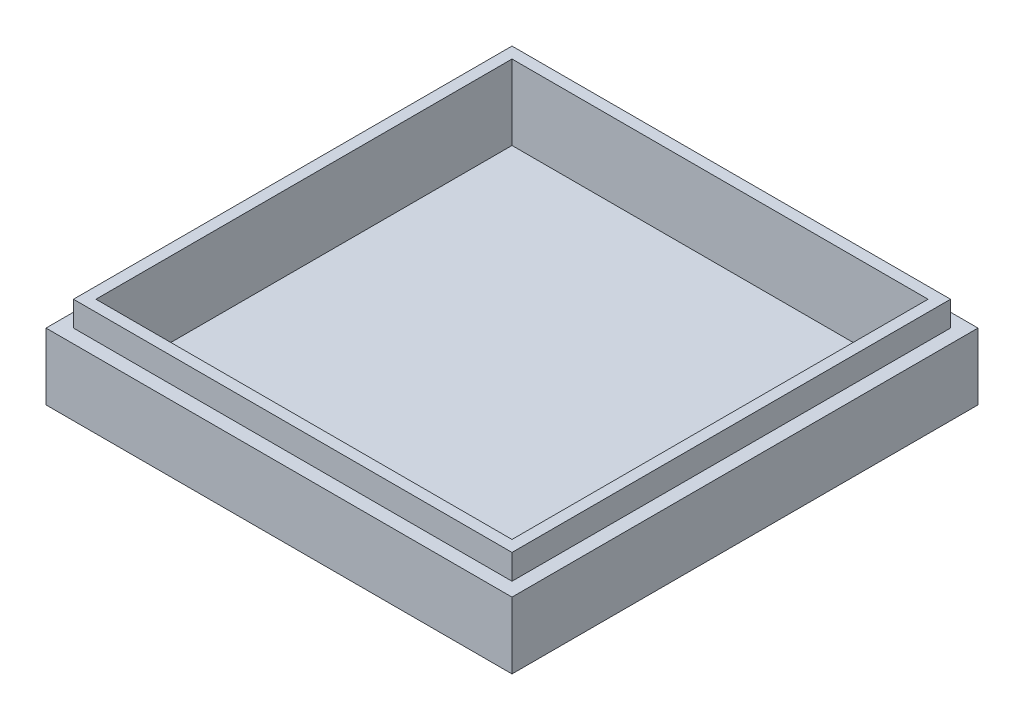
ISO-10303-21;
HEADER;
FILE_DESCRIPTION(('STEP AP214'),'2;1');
FILE_NAME('part.step','',(''),(''),'','','');
FILE_SCHEMA(('AUTOMOTIVE_DESIGN { 1 0 10303 214 1 1 1 1 }'));
ENDSEC;
DATA;
#1=APPLICATION_CONTEXT('core data for automotive mechanical design processes');
#2=APPLICATION_PROTOCOL_DEFINITION('international standard','automotive_design',2000,#1);
#3=PRODUCT_CONTEXT('',#1,'mechanical');
#4=PRODUCT('Part','Part','',(#3));
#5=PRODUCT_RELATED_PRODUCT_CATEGORY('part','',(#4));
#6=PRODUCT_DEFINITION_FORMATION('','',#4);
#7=PRODUCT_DEFINITION_CONTEXT('part definition',#1,'design');
#8=PRODUCT_DEFINITION('design','',#6,#7);
#9=PRODUCT_DEFINITION_SHAPE('','',#8);
#10=(LENGTH_UNIT() NAMED_UNIT(*) SI_UNIT(.MILLI.,.METRE.));
#11=(NAMED_UNIT(*) PLANE_ANGLE_UNIT() SI_UNIT($,.RADIAN.));
#12=(NAMED_UNIT(*) SI_UNIT($,.STERADIAN.) SOLID_ANGLE_UNIT());
#13=UNCERTAINTY_MEASURE_WITH_UNIT(LENGTH_MEASURE(1.E-05),#10,'distance_accuracy_value','');
#14=(GEOMETRIC_REPRESENTATION_CONTEXT(3) GLOBAL_UNCERTAINTY_ASSIGNED_CONTEXT((#13)) GLOBAL_UNIT_ASSIGNED_CONTEXT((#10,
#11,#12)) REPRESENTATION_CONTEXT('',''));
#15=CARTESIAN_POINT('',(0.,0.,0.));
#16=DIRECTION('',(0.,0.,1.));
#17=DIRECTION('',(1.,0.,0.));
#18=AXIS2_PLACEMENT_3D('',#15,#16,#17);
#19=CARTESIAN_POINT('',(0.,6.,0.));
#20=DIRECTION('',(0.,1.,0.));
#21=DIRECTION('',(0.,0.,1.));
#22=AXIS2_PLACEMENT_3D('',#19,#20,#21);
#23=PLANE('',#22);
#24=DIRECTION('',(0.,0.,1.));
#25=VECTOR('',#24,1.);
#26=CARTESIAN_POINT('',(-28.,6.,-28.));
#27=LINE('',#26,#25);
#28=CARTESIAN_POINT('',(-28.,6.,-28.));
#29=VERTEX_POINT('',#28);
#30=CARTESIAN_POINT('',(-28.,6.,28.));
#31=VERTEX_POINT('',#30);
#32=EDGE_CURVE('E191',#29,#31,#27,.T.);
#33=ORIENTED_EDGE('',*,*,#32,.T.);
#34=DIRECTION('',(1.,0.,0.));
#35=VECTOR('',#34,1.);
#36=CARTESIAN_POINT('',(-28.,6.,28.));
#37=LINE('',#36,#35);
#38=CARTESIAN_POINT('',(28.,6.,28.));
#39=VERTEX_POINT('',#38);
#40=EDGE_CURVE('E194',#31,#39,#37,.T.);
#41=ORIENTED_EDGE('',*,*,#40,.T.);
#42=DIRECTION('',(0.,0.,-1.));
#43=VECTOR('',#42,1.);
#44=CARTESIAN_POINT('',(28.,6.,-28.));
#45=LINE('',#44,#43);
#46=CARTESIAN_POINT('',(28.,6.,-28.));
#47=VERTEX_POINT('',#46);
#48=EDGE_CURVE('E197',#39,#47,#45,.T.);
#49=ORIENTED_EDGE('',*,*,#48,.T.);
#50=DIRECTION('',(-1.,0.,0.));
#51=VECTOR('',#50,1.);
#52=CARTESIAN_POINT('',(-28.,6.,-28.));
#53=LINE('',#52,#51);
#54=EDGE_CURVE('E200',#47,#29,#53,.T.);
#55=ORIENTED_EDGE('',*,*,#54,.T.);
#56=EDGE_LOOP('',(#33,#41,#49,#55));
#57=FACE_BOUND('',#56,.T.);
#58=DIRECTION('',(0.,0.,-1.));
#59=VECTOR('',#58,1.);
#60=CARTESIAN_POINT('',(26.35,6.,26.35));
#61=LINE('',#60,#59);
#62=CARTESIAN_POINT('',(26.35,6.,26.35));
#63=VERTEX_POINT('',#62);
#64=CARTESIAN_POINT('',(26.35,6.,-26.35));
#65=VERTEX_POINT('',#64);
#66=EDGE_CURVE('E166',#63,#65,#61,.T.);
#67=ORIENTED_EDGE('',*,*,#66,.F.);
#68=DIRECTION('',(1.,0.,0.));
#69=VECTOR('',#68,1.);
#70=CARTESIAN_POINT('',(-26.35,6.,26.35));
#71=LINE('',#70,#69);
#72=CARTESIAN_POINT('',(-26.35,6.,26.35));
#73=VERTEX_POINT('',#72);
#74=EDGE_CURVE('E152',#73,#63,#71,.T.);
#75=ORIENTED_EDGE('',*,*,#74,.F.);
#76=DIRECTION('',(0.,0.,1.));
#77=VECTOR('',#76,1.);
#78=CARTESIAN_POINT('',(-26.35,6.,-26.35));
#79=LINE('',#78,#77);
#80=CARTESIAN_POINT('',(-26.35,6.,-26.35));
#81=VERTEX_POINT('',#80);
#82=EDGE_CURVE('E157',#81,#73,#79,.T.);
#83=ORIENTED_EDGE('',*,*,#82,.F.);
#84=DIRECTION('',(-1.,0.,0.));
#85=VECTOR('',#84,1.);
#86=CARTESIAN_POINT('',(26.35,6.,-26.35));
#87=LINE('',#86,#85);
#88=EDGE_CURVE('E168',#65,#81,#87,.T.);
#89=ORIENTED_EDGE('',*,*,#88,.F.);
#90=EDGE_LOOP('',(#67,#75,#83,#89));
#91=FACE_BOUND('',#90,.T.);
#92=ADVANCED_FACE('F33',(#57,#91),#23,.T.);
#93=CARTESIAN_POINT('',(-28.,-2.,-28.));
#94=DIRECTION('',(-1.,0.,0.));
#95=DIRECTION('',(0.,0.,1.));
#96=AXIS2_PLACEMENT_3D('',#93,#94,#95);
#97=PLANE('',#96);
#98=DIRECTION('',(0.,1.,0.));
#99=VECTOR('',#98,1.);
#100=CARTESIAN_POINT('',(-28.,-2.,28.));
#101=LINE('',#100,#99);
#102=CARTESIAN_POINT('',(-28.,-2.,28.));
#103=VERTEX_POINT('',#102);
#104=EDGE_CURVE('E37',#103,#31,#101,.T.);
#105=ORIENTED_EDGE('',*,*,#104,.T.);
#106=ORIENTED_EDGE('',*,*,#32,.F.);
#107=DIRECTION('',(0.,1.,0.));
#108=VECTOR('',#107,1.);
#109=CARTESIAN_POINT('',(-28.,-2.,-28.));
#110=LINE('',#109,#108);
#111=CARTESIAN_POINT('',(-28.,-2.,-28.));
#112=VERTEX_POINT('',#111);
#113=EDGE_CURVE('E11',#112,#29,#110,.T.);
#114=ORIENTED_EDGE('',*,*,#113,.F.);
#115=DIRECTION('',(0.,0.,1.));
#116=VECTOR('',#115,1.);
#117=CARTESIAN_POINT('',(-28.,-2.,-28.));
#118=LINE('',#117,#116);
#119=EDGE_CURVE('E203',#112,#103,#118,.T.);
#120=ORIENTED_EDGE('',*,*,#119,.T.);
#121=EDGE_LOOP('',(#105,#106,#114,#120));
#122=FACE_BOUND('',#121,.T.);
#123=ADVANCED_FACE('F35',(#122),#97,.T.);
#124=CARTESIAN_POINT('',(-28.,-2.,-28.));
#125=DIRECTION('',(0.,0.,1.));
#126=DIRECTION('',(1.,0.,0.));
#127=AXIS2_PLACEMENT_3D('',#124,#125,#126);
#128=PLANE('',#127);
#129=ORIENTED_EDGE('',*,*,#113,.T.);
#130=ORIENTED_EDGE('',*,*,#54,.F.);
#131=DIRECTION('',(0.,1.,0.));
#132=VECTOR('',#131,1.);
#133=CARTESIAN_POINT('',(28.,-2.,-28.));
#134=LINE('',#133,#132);
#135=CARTESIAN_POINT('',(28.,-2.,-28.));
#136=VERTEX_POINT('',#135);
#137=EDGE_CURVE('E42',#136,#47,#134,.T.);
#138=ORIENTED_EDGE('',*,*,#137,.F.);
#139=DIRECTION('',(1.,0.,0.));
#140=VECTOR('',#139,1.);
#141=CARTESIAN_POINT('',(-28.,-2.,-28.));
#142=LINE('',#141,#140);
#143=EDGE_CURVE('E211',#112,#136,#142,.T.);
#144=ORIENTED_EDGE('',*,*,#143,.F.);
#145=EDGE_LOOP('',(#129,#130,#138,#144));
#146=FACE_BOUND('',#145,.T.);
#147=ADVANCED_FACE('F228',(#146),#128,.F.);
#148=CARTESIAN_POINT('',(28.,-2.,-28.));
#149=DIRECTION('',(-1.,0.,0.));
#150=DIRECTION('',(0.,0.,1.));
#151=AXIS2_PLACEMENT_3D('',#148,#149,#150);
#152=PLANE('',#151);
#153=ORIENTED_EDGE('',*,*,#137,.T.);
#154=ORIENTED_EDGE('',*,*,#48,.F.);
#155=DIRECTION('',(0.,1.,0.));
#156=VECTOR('',#155,1.);
#157=CARTESIAN_POINT('',(28.,-2.,28.));
#158=LINE('',#157,#156);
#159=CARTESIAN_POINT('',(28.,-2.,28.));
#160=VERTEX_POINT('',#159);
#161=EDGE_CURVE('E213',#160,#39,#158,.T.);
#162=ORIENTED_EDGE('',*,*,#161,.F.);
#163=DIRECTION('',(0.,0.,1.));
#164=VECTOR('',#163,1.);
#165=CARTESIAN_POINT('',(28.,-2.,-28.));
#166=LINE('',#165,#164);
#167=EDGE_CURVE('E209',#136,#160,#166,.T.);
#168=ORIENTED_EDGE('',*,*,#167,.F.);
#169=EDGE_LOOP('',(#153,#154,#162,#168));
#170=FACE_BOUND('',#169,.T.);
#171=ADVANCED_FACE('F234',(#170),#152,.F.);
#172=CARTESIAN_POINT('',(-28.,-2.,28.));
#173=DIRECTION('',(0.,0.,1.));
#174=DIRECTION('',(1.,0.,0.));
#175=AXIS2_PLACEMENT_3D('',#172,#173,#174);
#176=PLANE('',#175);
#177=ORIENTED_EDGE('',*,*,#161,.T.);
#178=ORIENTED_EDGE('',*,*,#40,.F.);
#179=ORIENTED_EDGE('',*,*,#104,.F.);
#180=DIRECTION('',(1.,0.,0.));
#181=VECTOR('',#180,1.);
#182=CARTESIAN_POINT('',(-28.,-2.,28.));
#183=LINE('',#182,#181);
#184=EDGE_CURVE('E206',#103,#160,#183,.T.);
#185=ORIENTED_EDGE('',*,*,#184,.T.);
#186=EDGE_LOOP('',(#177,#178,#179,#185));
#187=FACE_BOUND('',#186,.T.);
#188=ADVANCED_FACE('F221',(#187),#176,.T.);
#189=CARTESIAN_POINT('',(0.,-2.,0.));
#190=DIRECTION('',(0.,1.,0.));
#191=DIRECTION('',(0.,0.,1.));
#192=AXIS2_PLACEMENT_3D('',#189,#190,#191);
#193=PLANE('',#192);
#194=ORIENTED_EDGE('',*,*,#119,.F.);
#195=ORIENTED_EDGE('',*,*,#143,.T.);
#196=ORIENTED_EDGE('',*,*,#167,.T.);
#197=ORIENTED_EDGE('',*,*,#184,.F.);
#198=EDGE_LOOP('',(#194,#195,#196,#197));
#199=FACE_BOUND('',#198,.T.);
#200=ADVANCED_FACE('F232',(#199),#193,.F.);
#201=CARTESIAN_POINT('',(0.,9.,0.));
#202=DIRECTION('',(0.,1.,0.));
#203=DIRECTION('',(0.,0.,1.));
#204=AXIS2_PLACEMENT_3D('',#201,#202,#203);
#205=PLANE('',#204);
#206=DIRECTION('',(1.,0.,0.));
#207=VECTOR('',#206,1.);
#208=CARTESIAN_POINT('',(-26.35,9.,26.35));
#209=LINE('',#208,#207);
#210=CARTESIAN_POINT('',(-26.35,9.,26.35));
#211=VERTEX_POINT('',#210);
#212=CARTESIAN_POINT('',(26.35,9.,26.35));
#213=VERTEX_POINT('',#212);
#214=EDGE_CURVE('E153',#211,#213,#209,.T.);
#215=ORIENTED_EDGE('',*,*,#214,.T.);
#216=DIRECTION('',(0.,0.,-1.));
#217=VECTOR('',#216,1.);
#218=CARTESIAN_POINT('',(26.35,9.,26.35));
#219=LINE('',#218,#217);
#220=CARTESIAN_POINT('',(26.35,9.,-26.35));
#221=VERTEX_POINT('',#220);
#222=EDGE_CURVE('E156',#213,#221,#219,.T.);
#223=ORIENTED_EDGE('',*,*,#222,.T.);
#224=DIRECTION('',(-1.,0.,0.));
#225=VECTOR('',#224,1.);
#226=CARTESIAN_POINT('',(26.35,9.,-26.35));
#227=LINE('',#226,#225);
#228=CARTESIAN_POINT('',(-26.35,9.,-26.35));
#229=VERTEX_POINT('',#228);
#230=EDGE_CURVE('E159',#221,#229,#227,.T.);
#231=ORIENTED_EDGE('',*,*,#230,.T.);
#232=DIRECTION('',(0.,0.,1.));
#233=VECTOR('',#232,1.);
#234=CARTESIAN_POINT('',(-26.35,9.,-26.35));
#235=LINE('',#234,#233);
#236=EDGE_CURVE('E161',#229,#211,#235,.T.);
#237=ORIENTED_EDGE('',*,*,#236,.T.);
#238=EDGE_LOOP('',(#215,#223,#231,#237));
#239=FACE_BOUND('',#238,.T.);
#240=DIRECTION('',(0.,0.,-1.));
#241=VECTOR('',#240,1.);
#242=CARTESIAN_POINT('',(25.,9.,25.));
#243=LINE('',#242,#241);
#244=CARTESIAN_POINT('',(25.,9.,25.));
#245=VERTEX_POINT('',#244);
#246=CARTESIAN_POINT('',(25.,9.,-25.));
#247=VERTEX_POINT('',#246);
#248=EDGE_CURVE('E129',#245,#247,#243,.T.);
#249=ORIENTED_EDGE('',*,*,#248,.F.);
#250=DIRECTION('',(1.,0.,0.));
#251=VECTOR('',#250,1.);
#252=CARTESIAN_POINT('',(-25.,9.,25.));
#253=LINE('',#252,#251);
#254=CARTESIAN_POINT('',(-25.,9.,25.));
#255=VERTEX_POINT('',#254);
#256=EDGE_CURVE('E137',#255,#245,#253,.T.);
#257=ORIENTED_EDGE('',*,*,#256,.F.);
#258=DIRECTION('',(0.,0.,1.));
#259=VECTOR('',#258,1.);
#260=CARTESIAN_POINT('',(-25.,9.,-25.));
#261=LINE('',#260,#259);
#262=CARTESIAN_POINT('',(-25.,9.,-25.));
#263=VERTEX_POINT('',#262);
#264=EDGE_CURVE('E148',#263,#255,#261,.T.);
#265=ORIENTED_EDGE('',*,*,#264,.F.);
#266=DIRECTION('',(-1.,0.,0.));
#267=VECTOR('',#266,1.);
#268=CARTESIAN_POINT('',(25.,9.,-25.));
#269=LINE('',#268,#267);
#270=EDGE_CURVE('E146',#247,#263,#269,.T.);
#271=ORIENTED_EDGE('',*,*,#270,.F.);
#272=EDGE_LOOP('',(#249,#257,#265,#271));
#273=FACE_BOUND('',#272,.T.);
#274=ADVANCED_FACE('F144',(#239,#273),#205,.T.);
#275=CARTESIAN_POINT('',(-26.35,9.,26.35));
#276=DIRECTION('',(0.,0.,-1.));
#277=DIRECTION('',(-1.,0.,0.));
#278=AXIS2_PLACEMENT_3D('',#275,#276,#277);
#279=PLANE('',#278);
#280=ORIENTED_EDGE('',*,*,#74,.T.);
#281=DIRECTION('',(0.,-1.,0.));
#282=VECTOR('',#281,1.);
#283=CARTESIAN_POINT('',(26.35,9.,26.35));
#284=LINE('',#283,#282);
#285=EDGE_CURVE('E177',#213,#63,#284,.T.);
#286=ORIENTED_EDGE('',*,*,#285,.F.);
#287=ORIENTED_EDGE('',*,*,#214,.F.);
#288=DIRECTION('',(0.,-1.,0.));
#289=VECTOR('',#288,1.);
#290=CARTESIAN_POINT('',(-26.35,9.,26.35));
#291=LINE('',#290,#289);
#292=EDGE_CURVE('E163',#211,#73,#291,.T.);
#293=ORIENTED_EDGE('',*,*,#292,.T.);
#294=EDGE_LOOP('',(#280,#286,#287,#293));
#295=FACE_BOUND('',#294,.T.);
#296=ADVANCED_FACE('F273',(#295),#279,.F.);
#297=CARTESIAN_POINT('',(26.35,9.,26.35));
#298=DIRECTION('',(-1.,0.,0.));
#299=DIRECTION('',(0.,0.,1.));
#300=AXIS2_PLACEMENT_3D('',#297,#298,#299);
#301=PLANE('',#300);
#302=ORIENTED_EDGE('',*,*,#66,.T.);
#303=DIRECTION('',(0.,-1.,0.));
#304=VECTOR('',#303,1.);
#305=CARTESIAN_POINT('',(26.35,9.,-26.35));
#306=LINE('',#305,#304);
#307=EDGE_CURVE('E174',#221,#65,#306,.T.);
#308=ORIENTED_EDGE('',*,*,#307,.F.);
#309=ORIENTED_EDGE('',*,*,#222,.F.);
#310=ORIENTED_EDGE('',*,*,#285,.T.);
#311=EDGE_LOOP('',(#302,#308,#309,#310));
#312=FACE_BOUND('',#311,.T.);
#313=ADVANCED_FACE('F266',(#312),#301,.F.);
#314=CARTESIAN_POINT('',(26.35,9.,-26.35));
#315=DIRECTION('',(0.,0.,1.));
#316=DIRECTION('',(1.,0.,0.));
#317=AXIS2_PLACEMENT_3D('',#314,#315,#316);
#318=PLANE('',#317);
#319=ORIENTED_EDGE('',*,*,#88,.T.);
#320=DIRECTION('',(0.,-1.,0.));
#321=VECTOR('',#320,1.);
#322=CARTESIAN_POINT('',(-26.35,9.,-26.35));
#323=LINE('',#322,#321);
#324=EDGE_CURVE('E50',#229,#81,#323,.T.);
#325=ORIENTED_EDGE('',*,*,#324,.F.);
#326=ORIENTED_EDGE('',*,*,#230,.F.);
#327=ORIENTED_EDGE('',*,*,#307,.T.);
#328=EDGE_LOOP('',(#319,#325,#326,#327));
#329=FACE_BOUND('',#328,.T.);
#330=ADVANCED_FACE('F261',(#329),#318,.F.);
#331=CARTESIAN_POINT('',(-26.35,9.,-26.35));
#332=DIRECTION('',(1.,0.,0.));
#333=DIRECTION('',(0.,0.,-1.));
#334=AXIS2_PLACEMENT_3D('',#331,#332,#333);
#335=PLANE('',#334);
#336=ORIENTED_EDGE('',*,*,#82,.T.);
#337=ORIENTED_EDGE('',*,*,#292,.F.);
#338=ORIENTED_EDGE('',*,*,#236,.F.);
#339=ORIENTED_EDGE('',*,*,#324,.T.);
#340=EDGE_LOOP('',(#336,#337,#338,#339));
#341=FACE_BOUND('',#340,.T.);
#342=ADVANCED_FACE('F254',(#341),#335,.F.);
#343=CARTESIAN_POINT('',(0.,0.,0.));
#344=DIRECTION('',(0.,1.,0.));
#345=DIRECTION('',(0.,0.,1.));
#346=AXIS2_PLACEMENT_3D('',#343,#344,#345);
#347=PLANE('',#346);
#348=DIRECTION('',(0.,0.,-1.));
#349=VECTOR('',#348,1.);
#350=CARTESIAN_POINT('',(25.,0.,-25.));
#351=LINE('',#350,#349);
#352=CARTESIAN_POINT('',(25.,0.,25.));
#353=VERTEX_POINT('',#352);
#354=CARTESIAN_POINT('',(25.,0.,-25.));
#355=VERTEX_POINT('',#354);
#356=EDGE_CURVE('E58',#353,#355,#351,.T.);
#357=ORIENTED_EDGE('',*,*,#356,.T.);
#358=DIRECTION('',(-1.,0.,0.));
#359=VECTOR('',#358,1.);
#360=CARTESIAN_POINT('',(-25.,0.,-25.));
#361=LINE('',#360,#359);
#362=CARTESIAN_POINT('',(-25.,0.,-25.));
#363=VERTEX_POINT('',#362);
#364=EDGE_CURVE('E180',#355,#363,#361,.T.);
#365=ORIENTED_EDGE('',*,*,#364,.T.);
#366=DIRECTION('',(0.,0.,1.));
#367=VECTOR('',#366,1.);
#368=CARTESIAN_POINT('',(-25.,0.,-25.));
#369=LINE('',#368,#367);
#370=CARTESIAN_POINT('',(-25.,0.,25.));
#371=VERTEX_POINT('',#370);
#372=EDGE_CURVE('E182',#363,#371,#369,.T.);
#373=ORIENTED_EDGE('',*,*,#372,.T.);
#374=DIRECTION('',(1.,0.,0.));
#375=VECTOR('',#374,1.);
#376=CARTESIAN_POINT('',(-25.,0.,25.));
#377=LINE('',#376,#375);
#378=EDGE_CURVE('E134',#371,#353,#377,.T.);
#379=ORIENTED_EDGE('',*,*,#378,.T.);
#380=EDGE_LOOP('',(#357,#365,#373,#379));
#381=FACE_BOUND('',#380,.T.);
#382=ADVANCED_FACE('F252',(#381),#347,.T.);
#383=CARTESIAN_POINT('',(-25.,6.,25.));
#384=DIRECTION('',(0.,0.,-1.));
#385=DIRECTION('',(-1.,0.,0.));
#386=AXIS2_PLACEMENT_3D('',#383,#384,#385);
#387=PLANE('',#386);
#388=ORIENTED_EDGE('',*,*,#378,.F.);
#389=DIRECTION('',(0.,-1.,0.));
#390=VECTOR('',#389,1.);
#391=CARTESIAN_POINT('',(-25.,6.,25.));
#392=LINE('',#391,#390);
#393=EDGE_CURVE('E133',#255,#371,#392,.T.);
#394=ORIENTED_EDGE('',*,*,#393,.F.);
#395=ORIENTED_EDGE('',*,*,#256,.T.);
#396=DIRECTION('',(0.,-1.,0.));
#397=VECTOR('',#396,1.);
#398=CARTESIAN_POINT('',(25.,6.,25.));
#399=LINE('',#398,#397);
#400=EDGE_CURVE('E124',#245,#353,#399,.T.);
#401=ORIENTED_EDGE('',*,*,#400,.T.);
#402=EDGE_LOOP('',(#388,#394,#395,#401));
#403=FACE_BOUND('',#402,.T.);
#404=ADVANCED_FACE('F138',(#403),#387,.T.);
#405=CARTESIAN_POINT('',(-25.,6.,-25.));
#406=DIRECTION('',(1.,0.,0.));
#407=DIRECTION('',(0.,0.,-1.));
#408=AXIS2_PLACEMENT_3D('',#405,#406,#407);
#409=PLANE('',#408);
#410=ORIENTED_EDGE('',*,*,#372,.F.);
#411=DIRECTION('',(0.,-1.,0.));
#412=VECTOR('',#411,1.);
#413=CARTESIAN_POINT('',(-25.,6.,-25.));
#414=LINE('',#413,#412);
#415=EDGE_CURVE('E186',#263,#363,#414,.T.);
#416=ORIENTED_EDGE('',*,*,#415,.F.);
#417=ORIENTED_EDGE('',*,*,#264,.T.);
#418=ORIENTED_EDGE('',*,*,#393,.T.);
#419=EDGE_LOOP('',(#410,#416,#417,#418));
#420=FACE_BOUND('',#419,.T.);
#421=ADVANCED_FACE('F259',(#420),#409,.T.);
#422=CARTESIAN_POINT('',(-25.,6.,-25.));
#423=DIRECTION('',(0.,0.,1.));
#424=DIRECTION('',(1.,0.,0.));
#425=AXIS2_PLACEMENT_3D('',#422,#423,#424);
#426=PLANE('',#425);
#427=ORIENTED_EDGE('',*,*,#364,.F.);
#428=DIRECTION('',(0.,-1.,0.));
#429=VECTOR('',#428,1.);
#430=CARTESIAN_POINT('',(25.,6.,-25.));
#431=LINE('',#430,#429);
#432=EDGE_CURVE('E189',#247,#355,#431,.T.);
#433=ORIENTED_EDGE('',*,*,#432,.F.);
#434=ORIENTED_EDGE('',*,*,#270,.T.);
#435=ORIENTED_EDGE('',*,*,#415,.T.);
#436=EDGE_LOOP('',(#427,#433,#434,#435));
#437=FACE_BOUND('',#436,.T.);
#438=ADVANCED_FACE('F279',(#437),#426,.T.);
#439=CARTESIAN_POINT('',(25.,6.,-25.));
#440=DIRECTION('',(-1.,0.,0.));
#441=DIRECTION('',(0.,0.,1.));
#442=AXIS2_PLACEMENT_3D('',#439,#440,#441);
#443=PLANE('',#442);
#444=ORIENTED_EDGE('',*,*,#356,.F.);
#445=ORIENTED_EDGE('',*,*,#400,.F.);
#446=ORIENTED_EDGE('',*,*,#248,.T.);
#447=ORIENTED_EDGE('',*,*,#432,.T.);
#448=EDGE_LOOP('',(#444,#445,#446,#447));
#449=FACE_BOUND('',#448,.T.);
#450=ADVANCED_FACE('F126',(#449),#443,.T.);
#451=CLOSED_SHELL('',(#92,#123,#147,#171,#188,#200,#274,#296,#313,#330,#342,#382,#404,#421,#438,#450));
#452=MANIFOLD_SOLID_BREP('B2',#451);
#453=ADVANCED_BREP_SHAPE_REPRESENTATION('',(#18,#452),#14);
#454=SHAPE_DEFINITION_REPRESENTATION(#9,#453);
ENDSEC;
END-ISO-10303-21;
